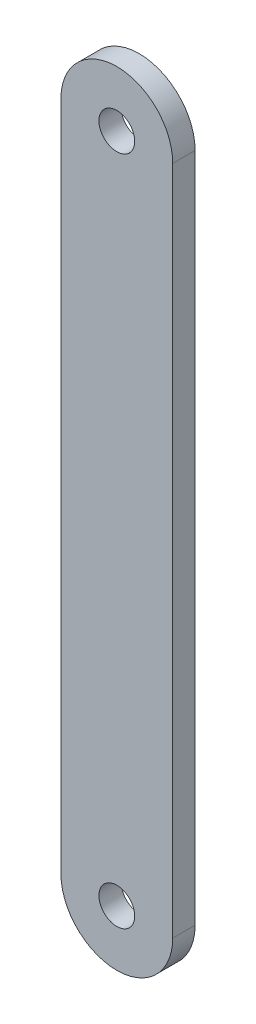
ISO-10303-21;
HEADER;
FILE_DESCRIPTION(('STEP AP214'),'2;1');
FILE_NAME('part.step','',(''),(''),'','','');
FILE_SCHEMA(('AUTOMOTIVE_DESIGN { 1 0 10303 214 1 1 1 1 }'));
ENDSEC;
DATA;
#1=APPLICATION_CONTEXT('core data for automotive mechanical design processes');
#2=APPLICATION_PROTOCOL_DEFINITION('international standard','automotive_design',2000,#1);
#3=PRODUCT_CONTEXT('',#1,'mechanical');
#4=PRODUCT('Part','Part','',(#3));
#5=PRODUCT_RELATED_PRODUCT_CATEGORY('part','',(#4));
#6=PRODUCT_DEFINITION_FORMATION('','',#4);
#7=PRODUCT_DEFINITION_CONTEXT('part definition',#1,'design');
#8=PRODUCT_DEFINITION('design','',#6,#7);
#9=PRODUCT_DEFINITION_SHAPE('','',#8);
#10=(LENGTH_UNIT() NAMED_UNIT(*) SI_UNIT(.MILLI.,.METRE.));
#11=(NAMED_UNIT(*) PLANE_ANGLE_UNIT() SI_UNIT($,.RADIAN.));
#12=(NAMED_UNIT(*) SI_UNIT($,.STERADIAN.) SOLID_ANGLE_UNIT());
#13=UNCERTAINTY_MEASURE_WITH_UNIT(LENGTH_MEASURE(1.E-05),#10,'distance_accuracy_value','');
#14=(GEOMETRIC_REPRESENTATION_CONTEXT(3) GLOBAL_UNCERTAINTY_ASSIGNED_CONTEXT((#13)) GLOBAL_UNIT_ASSIGNED_CONTEXT((#10,
#11,#12)) REPRESENTATION_CONTEXT('',''));
#15=CARTESIAN_POINT('',(0.,0.,0.));
#16=DIRECTION('',(0.,0.,1.));
#17=DIRECTION('',(1.,0.,0.));
#18=AXIS2_PLACEMENT_3D('',#15,#16,#17);
#19=CARTESIAN_POINT('',(0.,-30.,2.));
#20=DIRECTION('',(0.,0.,1.));
#21=DIRECTION('',(1.,0.,0.));
#22=AXIS2_PLACEMENT_3D('',#19,#20,#21);
#23=PLANE('',#22);
#24=CARTESIAN_POINT('',(0.,30.,2.));
#25=DIRECTION('',(0.,0.,1.));
#26=DIRECTION('',(1.,0.,0.));
#27=AXIS2_PLACEMENT_3D('',#24,#25,#26);
#28=CIRCLE('',#27,1.6);
#29=CARTESIAN_POINT('',(1.6,30.,2.));
#30=VERTEX_POINT('',#29);
#31=EDGE_CURVE('E112',#30,#30,#28,.T.);
#32=ORIENTED_EDGE('',*,*,#31,.F.);
#33=EDGE_LOOP('',(#32));
#34=FACE_BOUND('',#33,.T.);
#35=CARTESIAN_POINT('',(0.,-30.,2.));
#36=DIRECTION('',(0.,0.,1.));
#37=DIRECTION('',(1.,0.,0.));
#38=AXIS2_PLACEMENT_3D('',#35,#36,#37);
#39=CIRCLE('',#38,5.);
#40=CARTESIAN_POINT('',(-4.99999999999999,-30.,2.));
#41=VERTEX_POINT('',#40);
#42=CARTESIAN_POINT('',(5.00000000000001,-30.,2.));
#43=VERTEX_POINT('',#42);
#44=EDGE_CURVE('E92',#41,#43,#39,.T.);
#45=ORIENTED_EDGE('',*,*,#44,.T.);
#46=DIRECTION('',(0.,1.,0.));
#47=VECTOR('',#46,1.);
#48=CARTESIAN_POINT('',(5.00000000000001,-30.,2.));
#49=LINE('',#48,#47);
#50=CARTESIAN_POINT('',(5.,30.,2.));
#51=VERTEX_POINT('',#50);
#52=EDGE_CURVE('E87',#43,#51,#49,.T.);
#53=ORIENTED_EDGE('',*,*,#52,.T.);
#54=CARTESIAN_POINT('',(0.,30.,2.));
#55=DIRECTION('',(0.,0.,1.));
#56=DIRECTION('',(1.,0.,0.));
#57=AXIS2_PLACEMENT_3D('',#54,#55,#56);
#58=CIRCLE('',#57,5.);
#59=CARTESIAN_POINT('',(-4.99999999999999,30.,2.));
#60=VERTEX_POINT('',#59);
#61=EDGE_CURVE('E90',#51,#60,#58,.T.);
#62=ORIENTED_EDGE('',*,*,#61,.T.);
#63=DIRECTION('',(0.,-1.,0.));
#64=VECTOR('',#63,1.);
#65=CARTESIAN_POINT('',(-4.99999999999999,-30.,2.));
#66=LINE('',#65,#64);
#67=EDGE_CURVE('E57',#60,#41,#66,.T.);
#68=ORIENTED_EDGE('',*,*,#67,.T.);
#69=EDGE_LOOP('',(#45,#53,#62,#68));
#70=FACE_BOUND('',#69,.T.);
#71=CARTESIAN_POINT('',(0.,-30.,2.));
#72=DIRECTION('',(0.,0.,1.));
#73=DIRECTION('',(-1.,0.,0.));
#74=AXIS2_PLACEMENT_3D('',#71,#72,#73);
#75=CIRCLE('',#74,1.6);
#76=CARTESIAN_POINT('',(-1.6,-30.,2.));
#77=VERTEX_POINT('',#76);
#78=EDGE_CURVE('E134',#77,#77,#75,.T.);
#79=ORIENTED_EDGE('',*,*,#78,.F.);
#80=EDGE_LOOP('',(#79));
#81=FACE_BOUND('',#80,.T.);
#82=ADVANCED_FACE('F39',(#34,#70,#81),#23,.T.);
#83=CARTESIAN_POINT('',(0.,-30.,0.));
#84=DIRECTION('',(0.,0.,1.));
#85=DIRECTION('',(1.,0.,0.));
#86=AXIS2_PLACEMENT_3D('',#83,#84,#85);
#87=PLANE('',#86);
#88=CARTESIAN_POINT('',(0.,-30.,0.));
#89=DIRECTION('',(0.,0.,1.));
#90=DIRECTION('',(1.,0.,0.));
#91=AXIS2_PLACEMENT_3D('',#88,#89,#90);
#92=CIRCLE('',#91,5.);
#93=CARTESIAN_POINT('',(-4.99999999999999,-30.,0.));
#94=VERTEX_POINT('',#93);
#95=CARTESIAN_POINT('',(5.00000000000001,-30.,0.));
#96=VERTEX_POINT('',#95);
#97=EDGE_CURVE('E108',#94,#96,#92,.T.);
#98=ORIENTED_EDGE('',*,*,#97,.F.);
#99=DIRECTION('',(0.,-1.,0.));
#100=VECTOR('',#99,1.);
#101=CARTESIAN_POINT('',(-4.99999999999999,-30.,0.));
#102=LINE('',#101,#100);
#103=CARTESIAN_POINT('',(-4.99999999999999,30.,0.));
#104=VERTEX_POINT('',#103);
#105=EDGE_CURVE('E80',#104,#94,#102,.T.);
#106=ORIENTED_EDGE('',*,*,#105,.F.);
#107=CARTESIAN_POINT('',(0.,30.,0.));
#108=DIRECTION('',(0.,0.,1.));
#109=DIRECTION('',(1.,0.,0.));
#110=AXIS2_PLACEMENT_3D('',#107,#108,#109);
#111=CIRCLE('',#110,5.);
#112=CARTESIAN_POINT('',(5.,30.,0.));
#113=VERTEX_POINT('',#112);
#114=EDGE_CURVE('E74',#113,#104,#111,.T.);
#115=ORIENTED_EDGE('',*,*,#114,.F.);
#116=DIRECTION('',(0.,1.,0.));
#117=VECTOR('',#116,1.);
#118=CARTESIAN_POINT('',(5.00000000000001,-30.,0.));
#119=LINE('',#118,#117);
#120=EDGE_CURVE('E97',#96,#113,#119,.T.);
#121=ORIENTED_EDGE('',*,*,#120,.F.);
#122=EDGE_LOOP('',(#98,#106,#115,#121));
#123=FACE_BOUND('',#122,.T.);
#124=CARTESIAN_POINT('',(0.,30.,0.));
#125=DIRECTION('',(0.,0.,1.));
#126=DIRECTION('',(1.,0.,0.));
#127=AXIS2_PLACEMENT_3D('',#124,#125,#126);
#128=CIRCLE('',#127,1.6);
#129=CARTESIAN_POINT('',(1.6,30.,0.));
#130=VERTEX_POINT('',#129);
#131=EDGE_CURVE('E130',#130,#130,#128,.T.);
#132=ORIENTED_EDGE('',*,*,#131,.T.);
#133=EDGE_LOOP('',(#132));
#134=FACE_BOUND('',#133,.T.);
#135=CARTESIAN_POINT('',(0.,-30.,0.));
#136=DIRECTION('',(0.,0.,1.));
#137=DIRECTION('',(-1.,0.,0.));
#138=AXIS2_PLACEMENT_3D('',#135,#136,#137);
#139=CIRCLE('',#138,1.6);
#140=CARTESIAN_POINT('',(-1.6,-30.,0.));
#141=VERTEX_POINT('',#140);
#142=EDGE_CURVE('E138',#141,#141,#139,.T.);
#143=ORIENTED_EDGE('',*,*,#142,.T.);
#144=EDGE_LOOP('',(#143));
#145=FACE_BOUND('',#144,.T.);
#146=ADVANCED_FACE('F125',(#123,#134,#145),#87,.F.);
#147=CARTESIAN_POINT('',(0.,-30.,2.));
#148=DIRECTION('',(0.,0.,-1.));
#149=DIRECTION('',(-1.,0.,0.));
#150=AXIS2_PLACEMENT_3D('',#147,#148,#149);
#151=CYLINDRICAL_SURFACE('',#150,5.);
#152=ORIENTED_EDGE('',*,*,#97,.T.);
#153=DIRECTION('',(0.,0.,-1.));
#154=VECTOR('',#153,1.);
#155=CARTESIAN_POINT('',(5.00000000000001,-30.,2.));
#156=LINE('',#155,#154);
#157=EDGE_CURVE('E11',#43,#96,#156,.T.);
#158=ORIENTED_EDGE('',*,*,#157,.F.);
#159=ORIENTED_EDGE('',*,*,#44,.F.);
#160=DIRECTION('',(0.,0.,-1.));
#161=VECTOR('',#160,1.);
#162=CARTESIAN_POINT('',(-4.99999999999999,-30.,2.));
#163=LINE('',#162,#161);
#164=EDGE_CURVE('E104',#41,#94,#163,.T.);
#165=ORIENTED_EDGE('',*,*,#164,.T.);
#166=EDGE_LOOP('',(#152,#158,#159,#165));
#167=FACE_BOUND('',#166,.T.);
#168=ADVANCED_FACE('F41',(#167),#151,.T.);
#169=CARTESIAN_POINT('',(5.00000000000001,-30.,2.));
#170=DIRECTION('',(-1.,0.,0.));
#171=DIRECTION('',(0.,-1.,0.));
#172=AXIS2_PLACEMENT_3D('',#169,#170,#171);
#173=PLANE('',#172);
#174=ORIENTED_EDGE('',*,*,#120,.T.);
#175=DIRECTION('',(0.,0.,-1.));
#176=VECTOR('',#175,1.);
#177=CARTESIAN_POINT('',(5.,30.,2.));
#178=LINE('',#177,#176);
#179=EDGE_CURVE('E49',#51,#113,#178,.T.);
#180=ORIENTED_EDGE('',*,*,#179,.F.);
#181=ORIENTED_EDGE('',*,*,#52,.F.);
#182=ORIENTED_EDGE('',*,*,#157,.T.);
#183=EDGE_LOOP('',(#174,#180,#181,#182));
#184=FACE_BOUND('',#183,.T.);
#185=ADVANCED_FACE('F96',(#184),#173,.F.);
#186=CARTESIAN_POINT('',(0.,30.,2.));
#187=DIRECTION('',(0.,0.,-1.));
#188=DIRECTION('',(-1.,0.,0.));
#189=AXIS2_PLACEMENT_3D('',#186,#187,#188);
#190=CYLINDRICAL_SURFACE('',#189,5.);
#191=ORIENTED_EDGE('',*,*,#114,.T.);
#192=DIRECTION('',(0.,0.,-1.));
#193=VECTOR('',#192,1.);
#194=CARTESIAN_POINT('',(-4.99999999999999,30.,2.));
#195=LINE('',#194,#193);
#196=EDGE_CURVE('E99',#60,#104,#195,.T.);
#197=ORIENTED_EDGE('',*,*,#196,.F.);
#198=ORIENTED_EDGE('',*,*,#61,.F.);
#199=ORIENTED_EDGE('',*,*,#179,.T.);
#200=EDGE_LOOP('',(#191,#197,#198,#199));
#201=FACE_BOUND('',#200,.T.);
#202=ADVANCED_FACE('F100',(#201),#190,.T.);
#203=CARTESIAN_POINT('',(-4.99999999999999,-30.,2.));
#204=DIRECTION('',(1.,0.,0.));
#205=DIRECTION('',(0.,1.,0.));
#206=AXIS2_PLACEMENT_3D('',#203,#204,#205);
#207=PLANE('',#206);
#208=ORIENTED_EDGE('',*,*,#105,.T.);
#209=ORIENTED_EDGE('',*,*,#164,.F.);
#210=ORIENTED_EDGE('',*,*,#67,.F.);
#211=ORIENTED_EDGE('',*,*,#196,.T.);
#212=EDGE_LOOP('',(#208,#209,#210,#211));
#213=FACE_BOUND('',#212,.T.);
#214=ADVANCED_FACE('F122',(#213),#207,.F.);
#215=CARTESIAN_POINT('',(0.,30.,2.));
#216=DIRECTION('',(0.,0.,-1.));
#217=DIRECTION('',(-1.,0.,0.));
#218=AXIS2_PLACEMENT_3D('',#215,#216,#217);
#219=CYLINDRICAL_SURFACE('',#218,1.6);
#220=ORIENTED_EDGE('',*,*,#31,.T.);
#221=EDGE_LOOP('',(#220));
#222=FACE_BOUND('',#221,.T.);
#223=ORIENTED_EDGE('',*,*,#131,.F.);
#224=EDGE_LOOP('',(#223));
#225=FACE_BOUND('',#224,.T.);
#226=ADVANCED_FACE('F157',(#222,#225),#219,.F.);
#227=CARTESIAN_POINT('',(0.,-30.,2.));
#228=DIRECTION('',(0.,0.,-1.));
#229=DIRECTION('',(-1.,0.,0.));
#230=AXIS2_PLACEMENT_3D('',#227,#228,#229);
#231=CYLINDRICAL_SURFACE('',#230,1.6);
#232=ORIENTED_EDGE('',*,*,#78,.T.);
#233=EDGE_LOOP('',(#232));
#234=FACE_BOUND('',#233,.T.);
#235=ORIENTED_EDGE('',*,*,#142,.F.);
#236=EDGE_LOOP('',(#235));
#237=FACE_BOUND('',#236,.T.);
#238=ADVANCED_FACE('F146',(#234,#237),#231,.F.);
#239=CLOSED_SHELL('',(#82,#146,#168,#185,#202,#214,#226,#238));
#240=MANIFOLD_SOLID_BREP('B2',#239);
#241=ADVANCED_BREP_SHAPE_REPRESENTATION('',(#18,#240),#14);
#242=SHAPE_DEFINITION_REPRESENTATION(#9,#241);
ENDSEC;
END-ISO-10303-21;
